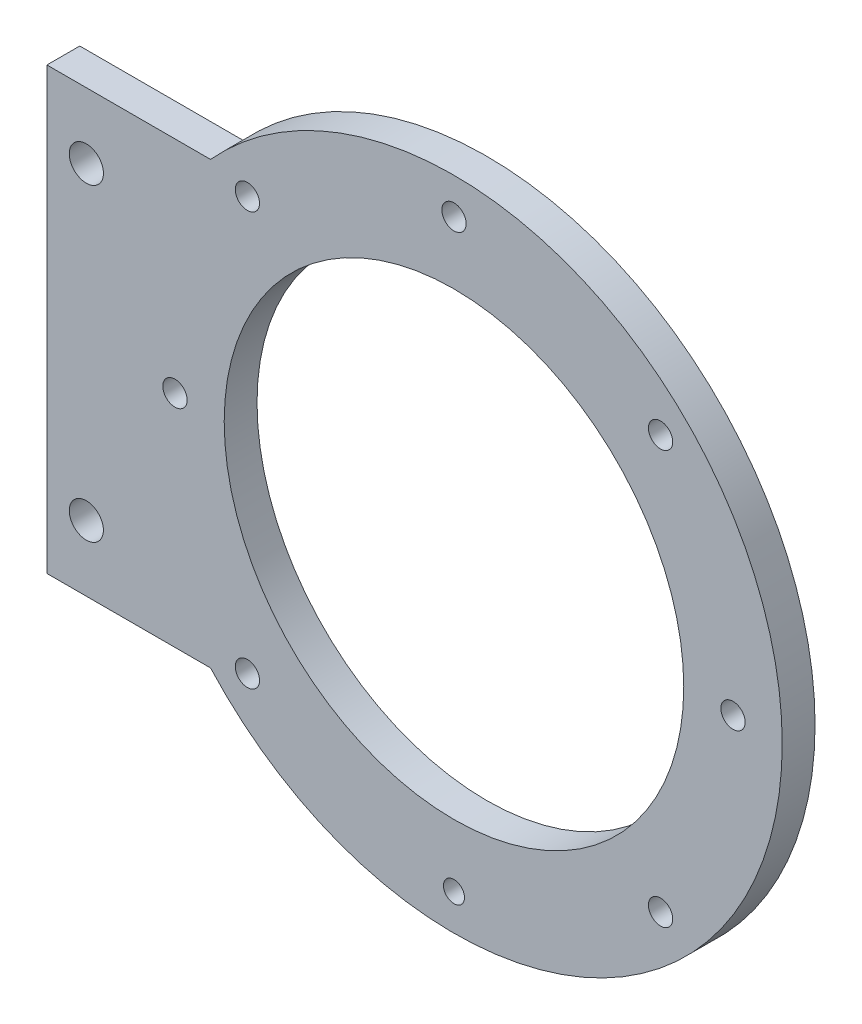
ISO-10303-21;
HEADER;
FILE_DESCRIPTION(('STEP AP214'),'2;1');
FILE_NAME('part.step','',(''),(''),'','','');
FILE_SCHEMA(('AUTOMOTIVE_DESIGN { 1 0 10303 214 1 1 1 1 }'));
ENDSEC;
DATA;
#1=APPLICATION_CONTEXT('core data for automotive mechanical design processes');
#2=APPLICATION_PROTOCOL_DEFINITION('international standard','automotive_design',2000,#1);
#3=PRODUCT_CONTEXT('',#1,'mechanical');
#4=PRODUCT('Part','Part','',(#3));
#5=PRODUCT_RELATED_PRODUCT_CATEGORY('part','',(#4));
#6=PRODUCT_DEFINITION_FORMATION('','',#4);
#7=PRODUCT_DEFINITION_CONTEXT('part definition',#1,'design');
#8=PRODUCT_DEFINITION('design','',#6,#7);
#9=PRODUCT_DEFINITION_SHAPE('','',#8);
#10=(LENGTH_UNIT() NAMED_UNIT(*) SI_UNIT(.MILLI.,.METRE.));
#11=(NAMED_UNIT(*) PLANE_ANGLE_UNIT() SI_UNIT($,.RADIAN.));
#12=(NAMED_UNIT(*) SI_UNIT($,.STERADIAN.) SOLID_ANGLE_UNIT());
#13=UNCERTAINTY_MEASURE_WITH_UNIT(LENGTH_MEASURE(1.E-05),#10,'distance_accuracy_value','');
#14=(GEOMETRIC_REPRESENTATION_CONTEXT(3) GLOBAL_UNCERTAINTY_ASSIGNED_CONTEXT((#13)) GLOBAL_UNIT_ASSIGNED_CONTEXT((#10,
#11,#12)) REPRESENTATION_CONTEXT('',''));
#15=CARTESIAN_POINT('',(0.,0.,0.));
#16=DIRECTION('',(0.,0.,1.));
#17=DIRECTION('',(1.,0.,0.));
#18=AXIS2_PLACEMENT_3D('',#15,#16,#17);
#19=CARTESIAN_POINT('',(0.,0.,-5.));
#20=DIRECTION('',(0.,1.,0.));
#21=DIRECTION('',(0.,0.,-1.));
#22=AXIS2_PLACEMENT_3D('',#19,#20,#21);
#23=PLANE('',#22);
#24=DIRECTION('',(1.,0.,0.));
#25=VECTOR('',#24,1.);
#26=CARTESIAN_POINT('',(0.,0.,0.));
#27=LINE('',#26,#25);
#28=CARTESIAN_POINT('',(-12.,0.,0.));
#29=VERTEX_POINT('',#28);
#30=CARTESIAN_POINT('',(12.9190075645217,0.,0.));
#31=VERTEX_POINT('',#30);
#32=EDGE_CURVE('E132',#29,#31,#27,.T.);
#33=ORIENTED_EDGE('',*,*,#32,.T.);
#34=DIRECTION('',(0.,0.,1.));
#35=VECTOR('',#34,1.);
#36=CARTESIAN_POINT('',(12.9190075645217,0.,-5.));
#37=LINE('',#36,#35);
#38=CARTESIAN_POINT('',(12.9190075645217,0.,-5.));
#39=VERTEX_POINT('',#38);
#40=EDGE_CURVE('E131',#39,#31,#37,.T.);
#41=ORIENTED_EDGE('',*,*,#40,.F.);
#42=DIRECTION('',(1.,0.,0.));
#43=VECTOR('',#42,1.);
#44=CARTESIAN_POINT('',(0.,0.,-5.));
#45=LINE('',#44,#43);
#46=CARTESIAN_POINT('',(-12.,0.,-5.));
#47=VERTEX_POINT('',#46);
#48=EDGE_CURVE('E114',#47,#39,#45,.T.);
#49=ORIENTED_EDGE('',*,*,#48,.F.);
#50=DIRECTION('',(0.,0.,1.));
#51=VECTOR('',#50,1.);
#52=CARTESIAN_POINT('',(-12.,0.,-5.));
#53=LINE('',#52,#51);
#54=EDGE_CURVE('E11',#47,#29,#53,.T.);
#55=ORIENTED_EDGE('',*,*,#54,.T.);
#56=EDGE_LOOP('',(#33,#41,#49,#55));
#57=FACE_BOUND('',#56,.T.);
#58=ADVANCED_FACE('F49',(#57),#23,.T.);
#59=CARTESIAN_POINT('',(-12.,0.,-5.));
#60=DIRECTION('',(-1.,0.,0.));
#61=DIRECTION('',(0.,0.,-1.));
#62=AXIS2_PLACEMENT_3D('',#59,#60,#61);
#63=PLANE('',#62);
#64=DIRECTION('',(0.,1.,0.));
#65=VECTOR('',#64,1.);
#66=CARTESIAN_POINT('',(-12.,0.,0.));
#67=LINE('',#66,#65);
#68=CARTESIAN_POINT('',(-12.,-67.0820393249937,0.));
#69=VERTEX_POINT('',#68);
#70=EDGE_CURVE('E136',#69,#29,#67,.T.);
#71=ORIENTED_EDGE('',*,*,#70,.T.);
#72=ORIENTED_EDGE('',*,*,#54,.F.);
#73=DIRECTION('',(0.,1.,0.));
#74=VECTOR('',#73,1.);
#75=CARTESIAN_POINT('',(-12.,0.,-5.));
#76=LINE('',#75,#74);
#77=CARTESIAN_POINT('',(-12.,-67.0820393249937,-5.));
#78=VERTEX_POINT('',#77);
#79=EDGE_CURVE('E93',#78,#47,#76,.T.);
#80=ORIENTED_EDGE('',*,*,#79,.F.);
#81=DIRECTION('',(0.,0.,1.));
#82=VECTOR('',#81,1.);
#83=CARTESIAN_POINT('',(-12.,-67.0820393249937,-5.));
#84=LINE('',#83,#82);
#85=EDGE_CURVE('E59',#78,#69,#84,.T.);
#86=ORIENTED_EDGE('',*,*,#85,.T.);
#87=EDGE_LOOP('',(#71,#72,#80,#86));
#88=FACE_BOUND('',#87,.T.);
#89=ADVANCED_FACE('F111',(#88),#63,.T.);
#90=CARTESIAN_POINT('',(0.,-67.0820393249937,-5.));
#91=DIRECTION('',(0.,1.,0.));
#92=DIRECTION('',(0.,0.,-1.));
#93=AXIS2_PLACEMENT_3D('',#90,#91,#92);
#94=PLANE('',#93);
#95=DIRECTION('',(1.,0.,0.));
#96=VECTOR('',#95,1.);
#97=CARTESIAN_POINT('',(0.,-67.0820393249937,0.));
#98=LINE('',#97,#96);
#99=CARTESIAN_POINT('',(12.9190075645217,-67.0820393249937,0.));
#100=VERTEX_POINT('',#99);
#101=EDGE_CURVE('E105',#69,#100,#98,.T.);
#102=ORIENTED_EDGE('',*,*,#101,.F.);
#103=ORIENTED_EDGE('',*,*,#85,.F.);
#104=DIRECTION('',(1.,0.,0.));
#105=VECTOR('',#104,1.);
#106=CARTESIAN_POINT('',(0.,-67.0820393249937,-5.));
#107=LINE('',#106,#105);
#108=CARTESIAN_POINT('',(12.9190075645217,-67.0820393249937,-5.));
#109=VERTEX_POINT('',#108);
#110=EDGE_CURVE('E96',#78,#109,#107,.T.);
#111=ORIENTED_EDGE('',*,*,#110,.T.);
#112=DIRECTION('',(0.,0.,1.));
#113=VECTOR('',#112,1.);
#114=CARTESIAN_POINT('',(12.9190075645217,-67.0820393249937,-5.));
#115=LINE('',#114,#113);
#116=EDGE_CURVE('E109',#109,#100,#115,.T.);
#117=ORIENTED_EDGE('',*,*,#116,.T.);
#118=EDGE_LOOP('',(#102,#103,#111,#117));
#119=FACE_BOUND('',#118,.T.);
#120=ADVANCED_FACE('F104',(#119),#94,.F.);
#121=CARTESIAN_POINT('',(-6.,-10.,-5.));
#122=DIRECTION('',(0.,0.,1.));
#123=DIRECTION('',(-1.,0.,0.));
#124=AXIS2_PLACEMENT_3D('',#121,#122,#123);
#125=CYLINDRICAL_SURFACE('',#124,2.6);
#126=CARTESIAN_POINT('',(-6.,-10.,-5.));
#127=DIRECTION('',(0.,0.,1.));
#128=DIRECTION('',(1.,0.,0.));
#129=AXIS2_PLACEMENT_3D('',#126,#127,#128);
#130=CIRCLE('',#129,2.6);
#131=CARTESIAN_POINT('',(-3.4,-10.,-5.));
#132=VERTEX_POINT('',#131);
#133=EDGE_CURVE('E123',#132,#132,#130,.T.);
#134=ORIENTED_EDGE('',*,*,#133,.F.);
#135=EDGE_LOOP('',(#134));
#136=FACE_BOUND('',#135,.T.);
#137=CARTESIAN_POINT('',(-6.,-10.,0.));
#138=DIRECTION('',(0.,0.,1.));
#139=DIRECTION('',(1.,0.,0.));
#140=AXIS2_PLACEMENT_3D('',#137,#138,#139);
#141=CIRCLE('',#140,2.6);
#142=CARTESIAN_POINT('',(-3.4,-10.,0.));
#143=VERTEX_POINT('',#142);
#144=EDGE_CURVE('E144',#143,#143,#141,.T.);
#145=ORIENTED_EDGE('',*,*,#144,.T.);
#146=EDGE_LOOP('',(#145));
#147=FACE_BOUND('',#146,.T.);
#148=ADVANCED_FACE('F230',(#136,#147),#125,.F.);
#149=CARTESIAN_POINT('',(50.,-33.5410196624969,-5.));
#150=DIRECTION('',(0.,0.,1.));
#151=DIRECTION('',(-1.,0.,0.));
#152=AXIS2_PLACEMENT_3D('',#149,#150,#151);
#153=CYLINDRICAL_SURFACE('',#152,50.);
#154=CARTESIAN_POINT('',(50.,-33.5410196624969,0.));
#155=DIRECTION('',(0.,0.,1.));
#156=DIRECTION('',(1.,0.,0.));
#157=AXIS2_PLACEMENT_3D('',#154,#155,#156);
#158=CIRCLE('',#157,50.);
#159=EDGE_CURVE('E82',#100,#31,#158,.T.);
#160=ORIENTED_EDGE('',*,*,#159,.F.);
#161=ORIENTED_EDGE('',*,*,#116,.F.);
#162=CARTESIAN_POINT('',(50.,-33.5410196624969,-5.));
#163=DIRECTION('',(0.,0.,1.));
#164=DIRECTION('',(1.,0.,0.));
#165=AXIS2_PLACEMENT_3D('',#162,#163,#164);
#166=CIRCLE('',#165,50.);
#167=EDGE_CURVE('E68',#109,#39,#166,.T.);
#168=ORIENTED_EDGE('',*,*,#167,.T.);
#169=ORIENTED_EDGE('',*,*,#40,.T.);
#170=EDGE_LOOP('',(#160,#161,#168,#169));
#171=FACE_BOUND('',#170,.T.);
#172=ADVANCED_FACE('F221',(#171),#153,.T.);
#173=CARTESIAN_POINT('',(-6.,-57.0820393249937,-5.));
#174=DIRECTION('',(0.,0.,1.));
#175=DIRECTION('',(-1.,0.,0.));
#176=AXIS2_PLACEMENT_3D('',#173,#174,#175);
#177=CYLINDRICAL_SURFACE('',#176,2.6);
#178=CARTESIAN_POINT('',(-6.,-57.0820393249937,-5.));
#179=DIRECTION('',(0.,0.,1.));
#180=DIRECTION('',(1.,0.,0.));
#181=AXIS2_PLACEMENT_3D('',#178,#179,#180);
#182=CIRCLE('',#181,2.6);
#183=CARTESIAN_POINT('',(-3.4,-57.0820393249937,-5.));
#184=VERTEX_POINT('',#183);
#185=EDGE_CURVE('E127',#184,#184,#182,.T.);
#186=ORIENTED_EDGE('',*,*,#185,.F.);
#187=EDGE_LOOP('',(#186));
#188=FACE_BOUND('',#187,.T.);
#189=CARTESIAN_POINT('',(-6.,-57.0820393249937,0.));
#190=DIRECTION('',(0.,0.,1.));
#191=DIRECTION('',(1.,0.,0.));
#192=AXIS2_PLACEMENT_3D('',#189,#190,#191);
#193=CIRCLE('',#192,2.6);
#194=CARTESIAN_POINT('',(-3.4,-57.0820393249937,0.));
#195=VERTEX_POINT('',#194);
#196=EDGE_CURVE('E117',#195,#195,#193,.T.);
#197=ORIENTED_EDGE('',*,*,#196,.T.);
#198=EDGE_LOOP('',(#197));
#199=FACE_BOUND('',#198,.T.);
#200=ADVANCED_FACE('F219',(#188,#199),#177,.F.);
#201=CARTESIAN_POINT('',(0.,0.,-5.));
#202=DIRECTION('',(0.,0.,-1.));
#203=DIRECTION('',(1.,0.,0.));
#204=AXIS2_PLACEMENT_3D('',#201,#202,#203);
#205=PLANE('',#204);
#206=CARTESIAN_POINT('',(50.,10.9589803375031,-5.));
#207=DIRECTION('',(0.,0.,1.));
#208=DIRECTION('',(1.,0.,0.));
#209=AXIS2_PLACEMENT_3D('',#206,#207,#208);
#210=CIRCLE('',#209,1.85);
#211=CARTESIAN_POINT('',(51.85,10.9589803375031,-5.));
#212=VERTEX_POINT('',#211);
#213=EDGE_CURVE('E160',#212,#212,#210,.T.);
#214=ORIENTED_EDGE('',*,*,#213,.T.);
#215=EDGE_LOOP('',(#214));
#216=FACE_BOUND('',#215,.T.);
#217=CARTESIAN_POINT('',(81.4662517628014,-65.0072714252982,-5.));
#218=DIRECTION('',(0.,0.,1.));
#219=DIRECTION('',(1.,0.,0.));
#220=AXIS2_PLACEMENT_3D('',#217,#218,#219);
#221=CIRCLE('',#220,1.85000000000001);
#222=CARTESIAN_POINT('',(83.3162517628014,-65.0072714252982,-5.));
#223=VERTEX_POINT('',#222);
#224=EDGE_CURVE('E403',#223,#223,#221,.T.);
#225=ORIENTED_EDGE('',*,*,#224,.T.);
#226=EDGE_LOOP('',(#225));
#227=FACE_BOUND('',#226,.T.);
#228=CARTESIAN_POINT('',(50.,-78.0410196624969,-5.));
#229=DIRECTION('',(0.,0.,1.));
#230=DIRECTION('',(1.,0.,0.));
#231=AXIS2_PLACEMENT_3D('',#228,#229,#230);
#232=CIRCLE('',#231,1.6);
#233=CARTESIAN_POINT('',(51.6,-78.0410196624969,-5.));
#234=VERTEX_POINT('',#233);
#235=EDGE_CURVE('E396',#234,#234,#232,.T.);
#236=ORIENTED_EDGE('',*,*,#235,.T.);
#237=EDGE_LOOP('',(#236));
#238=FACE_BOUND('',#237,.T.);
#239=CARTESIAN_POINT('',(18.5337482371986,-2.07476789969549,-5.));
#240=DIRECTION('',(0.,0.,1.));
#241=DIRECTION('',(1.,0.,0.));
#242=AXIS2_PLACEMENT_3D('',#239,#240,#241);
#243=CIRCLE('',#242,1.85);
#244=CARTESIAN_POINT('',(20.3837482371986,-2.07476789969549,-5.));
#245=VERTEX_POINT('',#244);
#246=EDGE_CURVE('E400',#245,#245,#243,.T.);
#247=ORIENTED_EDGE('',*,*,#246,.T.);
#248=EDGE_LOOP('',(#247));
#249=FACE_BOUND('',#248,.T.);
#250=CARTESIAN_POINT('',(81.4662517628014,-2.07476789969549,-5.));
#251=DIRECTION('',(0.,0.,1.));
#252=DIRECTION('',(1.,0.,0.));
#253=AXIS2_PLACEMENT_3D('',#250,#251,#252);
#254=CIRCLE('',#253,1.85);
#255=CARTESIAN_POINT('',(83.3162517628014,-2.07476789969549,-5.));
#256=VERTEX_POINT('',#255);
#257=EDGE_CURVE('E408',#256,#256,#254,.T.);
#258=ORIENTED_EDGE('',*,*,#257,.T.);
#259=EDGE_LOOP('',(#258));
#260=FACE_BOUND('',#259,.T.);
#261=CARTESIAN_POINT('',(18.5337482371987,-65.0072714252982,-5.));
#262=DIRECTION('',(0.,0.,1.));
#263=DIRECTION('',(1.,0.,0.));
#264=AXIS2_PLACEMENT_3D('',#261,#262,#263);
#265=CIRCLE('',#264,1.85);
#266=CARTESIAN_POINT('',(20.3837482371987,-65.0072714252982,-5.));
#267=VERTEX_POINT('',#266);
#268=EDGE_CURVE('E407',#267,#267,#265,.T.);
#269=ORIENTED_EDGE('',*,*,#268,.T.);
#270=EDGE_LOOP('',(#269));
#271=FACE_BOUND('',#270,.T.);
#272=CARTESIAN_POINT('',(50.,-33.5410196624969,-5.));
#273=DIRECTION('',(0.,0.,1.));
#274=DIRECTION('',(1.,0.,0.));
#275=AXIS2_PLACEMENT_3D('',#272,#273,#274);
#276=CIRCLE('',#275,35.);
#277=CARTESIAN_POINT('',(85.,-33.5410196624969,-5.));
#278=VERTEX_POINT('',#277);
#279=EDGE_CURVE('E178',#278,#278,#276,.T.);
#280=ORIENTED_EDGE('',*,*,#279,.T.);
#281=EDGE_LOOP('',(#280));
#282=FACE_BOUND('',#281,.T.);
#283=CARTESIAN_POINT('',(92.5,-33.5410196624969,-5.));
#284=DIRECTION('',(0.,0.,1.));
#285=DIRECTION('',(1.,0.,0.));
#286=AXIS2_PLACEMENT_3D('',#283,#284,#285);
#287=CIRCLE('',#286,1.85000000000001);
#288=CARTESIAN_POINT('',(94.35,-33.5410196624969,-5.));
#289=VERTEX_POINT('',#288);
#290=EDGE_CURVE('E196',#289,#289,#287,.T.);
#291=ORIENTED_EDGE('',*,*,#290,.T.);
#292=EDGE_LOOP('',(#291));
#293=FACE_BOUND('',#292,.T.);
#294=CARTESIAN_POINT('',(7.50000000000001,-33.5410196624969,-5.));
#295=DIRECTION('',(0.,0.,1.));
#296=DIRECTION('',(1.,0.,0.));
#297=AXIS2_PLACEMENT_3D('',#294,#295,#296);
#298=CIRCLE('',#297,1.85);
#299=CARTESIAN_POINT('',(9.35000000000001,-33.5410196624969,-5.));
#300=VERTEX_POINT('',#299);
#301=EDGE_CURVE('E200',#300,#300,#298,.T.);
#302=ORIENTED_EDGE('',*,*,#301,.T.);
#303=EDGE_LOOP('',(#302));
#304=FACE_BOUND('',#303,.T.);
#305=ORIENTED_EDGE('',*,*,#48,.T.);
#306=ORIENTED_EDGE('',*,*,#167,.F.);
#307=ORIENTED_EDGE('',*,*,#110,.F.);
#308=ORIENTED_EDGE('',*,*,#79,.T.);
#309=EDGE_LOOP('',(#305,#306,#307,#308));
#310=FACE_BOUND('',#309,.T.);
#311=ORIENTED_EDGE('',*,*,#133,.T.);
#312=EDGE_LOOP('',(#311));
#313=FACE_BOUND('',#312,.T.);
#314=ORIENTED_EDGE('',*,*,#185,.T.);
#315=EDGE_LOOP('',(#314));
#316=FACE_BOUND('',#315,.T.);
#317=ADVANCED_FACE('F98',(#216,#227,#238,#249,#260,#271,#282,#293,#304,#310,#313,#316),#205,.T.);
#318=CARTESIAN_POINT('',(0.,0.,0.));
#319=DIRECTION('',(0.,0.,-1.));
#320=DIRECTION('',(1.,0.,0.));
#321=AXIS2_PLACEMENT_3D('',#318,#319,#320);
#322=PLANE('',#321);
#323=CARTESIAN_POINT('',(50.,10.9589803375031,0.));
#324=DIRECTION('',(0.,0.,1.));
#325=DIRECTION('',(1.,0.,0.));
#326=AXIS2_PLACEMENT_3D('',#323,#324,#325);
#327=CIRCLE('',#326,1.85);
#328=CARTESIAN_POINT('',(51.85,10.9589803375031,0.));
#329=VERTEX_POINT('',#328);
#330=EDGE_CURVE('E52',#329,#329,#327,.T.);
#331=ORIENTED_EDGE('',*,*,#330,.F.);
#332=EDGE_LOOP('',(#331));
#333=FACE_BOUND('',#332,.T.);
#334=CARTESIAN_POINT('',(81.4662517628014,-65.0072714252982,0.));
#335=DIRECTION('',(0.,0.,1.));
#336=DIRECTION('',(1.,0.,0.));
#337=AXIS2_PLACEMENT_3D('',#334,#335,#336);
#338=CIRCLE('',#337,1.85000000000001);
#339=CARTESIAN_POINT('',(83.3162517628014,-65.0072714252982,0.));
#340=VERTEX_POINT('',#339);
#341=EDGE_CURVE('E171',#340,#340,#338,.T.);
#342=ORIENTED_EDGE('',*,*,#341,.F.);
#343=EDGE_LOOP('',(#342));
#344=FACE_BOUND('',#343,.T.);
#345=CARTESIAN_POINT('',(50.,-78.0410196624969,0.));
#346=DIRECTION('',(0.,0.,1.));
#347=DIRECTION('',(1.,0.,0.));
#348=AXIS2_PLACEMENT_3D('',#345,#346,#347);
#349=CIRCLE('',#348,1.6);
#350=CARTESIAN_POINT('',(51.6,-78.0410196624969,0.));
#351=VERTEX_POINT('',#350);
#352=EDGE_CURVE('E168',#351,#351,#349,.T.);
#353=ORIENTED_EDGE('',*,*,#352,.F.);
#354=EDGE_LOOP('',(#353));
#355=FACE_BOUND('',#354,.T.);
#356=CARTESIAN_POINT('',(18.5337482371986,-2.07476789969549,0.));
#357=DIRECTION('',(0.,0.,1.));
#358=DIRECTION('',(1.,0.,0.));
#359=AXIS2_PLACEMENT_3D('',#356,#357,#358);
#360=CIRCLE('',#359,1.85);
#361=CARTESIAN_POINT('',(20.3837482371986,-2.07476789969549,0.));
#362=VERTEX_POINT('',#361);
#363=EDGE_CURVE('E164',#362,#362,#360,.T.);
#364=ORIENTED_EDGE('',*,*,#363,.F.);
#365=EDGE_LOOP('',(#364));
#366=FACE_BOUND('',#365,.T.);
#367=CARTESIAN_POINT('',(81.4662517628014,-2.07476789969549,0.));
#368=DIRECTION('',(0.,0.,1.));
#369=DIRECTION('',(1.,0.,0.));
#370=AXIS2_PLACEMENT_3D('',#367,#368,#369);
#371=CIRCLE('',#370,1.85);
#372=CARTESIAN_POINT('',(83.3162517628014,-2.07476789969549,0.));
#373=VERTEX_POINT('',#372);
#374=EDGE_CURVE('E159',#373,#373,#371,.T.);
#375=ORIENTED_EDGE('',*,*,#374,.F.);
#376=EDGE_LOOP('',(#375));
#377=FACE_BOUND('',#376,.T.);
#378=CARTESIAN_POINT('',(18.5337482371987,-65.0072714252982,0.));
#379=DIRECTION('',(0.,0.,1.));
#380=DIRECTION('',(1.,0.,0.));
#381=AXIS2_PLACEMENT_3D('',#378,#379,#380);
#382=CIRCLE('',#381,1.85);
#383=CARTESIAN_POINT('',(20.3837482371987,-65.0072714252982,0.));
#384=VERTEX_POINT('',#383);
#385=EDGE_CURVE('E155',#384,#384,#382,.T.);
#386=ORIENTED_EDGE('',*,*,#385,.F.);
#387=EDGE_LOOP('',(#386));
#388=FACE_BOUND('',#387,.T.);
#389=CARTESIAN_POINT('',(50.,-33.5410196624969,0.));
#390=DIRECTION('',(0.,0.,1.));
#391=DIRECTION('',(1.,0.,0.));
#392=AXIS2_PLACEMENT_3D('',#389,#390,#391);
#393=CIRCLE('',#392,35.);
#394=CARTESIAN_POINT('',(85.,-33.5410196624969,0.));
#395=VERTEX_POINT('',#394);
#396=EDGE_CURVE('E183',#395,#395,#393,.T.);
#397=ORIENTED_EDGE('',*,*,#396,.F.);
#398=EDGE_LOOP('',(#397));
#399=FACE_BOUND('',#398,.T.);
#400=CARTESIAN_POINT('',(92.5,-33.5410196624969,0.));
#401=DIRECTION('',(0.,0.,1.));
#402=DIRECTION('',(1.,0.,0.));
#403=AXIS2_PLACEMENT_3D('',#400,#401,#402);
#404=CIRCLE('',#403,1.85000000000001);
#405=CARTESIAN_POINT('',(94.35,-33.5410196624969,0.));
#406=VERTEX_POINT('',#405);
#407=EDGE_CURVE('E137',#406,#406,#404,.T.);
#408=ORIENTED_EDGE('',*,*,#407,.F.);
#409=EDGE_LOOP('',(#408));
#410=FACE_BOUND('',#409,.T.);
#411=CARTESIAN_POINT('',(7.50000000000001,-33.5410196624969,0.));
#412=DIRECTION('',(0.,0.,1.));
#413=DIRECTION('',(1.,0.,0.));
#414=AXIS2_PLACEMENT_3D('',#411,#412,#413);
#415=CIRCLE('',#414,1.85);
#416=CARTESIAN_POINT('',(9.35000000000001,-33.5410196624969,0.));
#417=VERTEX_POINT('',#416);
#418=EDGE_CURVE('E189',#417,#417,#415,.T.);
#419=ORIENTED_EDGE('',*,*,#418,.F.);
#420=EDGE_LOOP('',(#419));
#421=FACE_BOUND('',#420,.T.);
#422=ORIENTED_EDGE('',*,*,#32,.F.);
#423=ORIENTED_EDGE('',*,*,#70,.F.);
#424=ORIENTED_EDGE('',*,*,#101,.T.);
#425=ORIENTED_EDGE('',*,*,#159,.T.);
#426=EDGE_LOOP('',(#422,#423,#424,#425));
#427=FACE_BOUND('',#426,.T.);
#428=ORIENTED_EDGE('',*,*,#144,.F.);
#429=EDGE_LOOP('',(#428));
#430=FACE_BOUND('',#429,.T.);
#431=ORIENTED_EDGE('',*,*,#196,.F.);
#432=EDGE_LOOP('',(#431));
#433=FACE_BOUND('',#432,.T.);
#434=ADVANCED_FACE('F210',(#333,#344,#355,#366,#377,#388,#399,#410,#421,#427,#430,#433),#322,.F.);
#435=CARTESIAN_POINT('',(7.50000000000001,-33.5410196624969,0.));
#436=DIRECTION('',(0.,0.,-1.));
#437=DIRECTION('',(1.,0.,0.));
#438=AXIS2_PLACEMENT_3D('',#435,#436,#437);
#439=CYLINDRICAL_SURFACE('',#438,1.85);
#440=ORIENTED_EDGE('',*,*,#418,.T.);
#441=EDGE_LOOP('',(#440));
#442=FACE_BOUND('',#441,.T.);
#443=ORIENTED_EDGE('',*,*,#301,.F.);
#444=EDGE_LOOP('',(#443));
#445=FACE_BOUND('',#444,.T.);
#446=ADVANCED_FACE('F207',(#442,#445),#439,.F.);
#447=CARTESIAN_POINT('',(92.5,-33.5410196624969,0.));
#448=DIRECTION('',(0.,0.,-1.));
#449=DIRECTION('',(1.,0.,0.));
#450=AXIS2_PLACEMENT_3D('',#447,#448,#449);
#451=CYLINDRICAL_SURFACE('',#450,1.85000000000001);
#452=ORIENTED_EDGE('',*,*,#407,.T.);
#453=EDGE_LOOP('',(#452));
#454=FACE_BOUND('',#453,.T.);
#455=ORIENTED_EDGE('',*,*,#290,.F.);
#456=EDGE_LOOP('',(#455));
#457=FACE_BOUND('',#456,.T.);
#458=ADVANCED_FACE('F310',(#454,#457),#451,.F.);
#459=CARTESIAN_POINT('',(50.,-33.5410196624969,0.));
#460=DIRECTION('',(0.,0.,-1.));
#461=DIRECTION('',(1.,0.,0.));
#462=AXIS2_PLACEMENT_3D('',#459,#460,#461);
#463=CYLINDRICAL_SURFACE('',#462,35.);
#464=ORIENTED_EDGE('',*,*,#396,.T.);
#465=EDGE_LOOP('',(#464));
#466=FACE_BOUND('',#465,.T.);
#467=ORIENTED_EDGE('',*,*,#279,.F.);
#468=EDGE_LOOP('',(#467));
#469=FACE_BOUND('',#468,.T.);
#470=ADVANCED_FACE('F319',(#466,#469),#463,.F.);
#471=CARTESIAN_POINT('',(18.5337482371987,-65.0072714252982,5.));
#472=DIRECTION('',(0.,0.,-1.));
#473=DIRECTION('',(1.,0.,0.));
#474=AXIS2_PLACEMENT_3D('',#471,#472,#473);
#475=CYLINDRICAL_SURFACE('',#474,1.85);
#476=ORIENTED_EDGE('',*,*,#268,.F.);
#477=EDGE_LOOP('',(#476));
#478=FACE_BOUND('',#477,.T.);
#479=ORIENTED_EDGE('',*,*,#385,.T.);
#480=EDGE_LOOP('',(#479));
#481=FACE_BOUND('',#480,.T.);
#482=ADVANCED_FACE('F330',(#478,#481),#475,.F.);
#483=CARTESIAN_POINT('',(81.4662517628014,-2.07476789969549,5.));
#484=DIRECTION('',(0.,0.,-1.));
#485=DIRECTION('',(1.,0.,0.));
#486=AXIS2_PLACEMENT_3D('',#483,#484,#485);
#487=CYLINDRICAL_SURFACE('',#486,1.85);
#488=ORIENTED_EDGE('',*,*,#257,.F.);
#489=EDGE_LOOP('',(#488));
#490=FACE_BOUND('',#489,.T.);
#491=ORIENTED_EDGE('',*,*,#374,.T.);
#492=EDGE_LOOP('',(#491));
#493=FACE_BOUND('',#492,.T.);
#494=ADVANCED_FACE('F340',(#490,#493),#487,.F.);
#495=CARTESIAN_POINT('',(18.5337482371986,-2.07476789969549,5.));
#496=DIRECTION('',(0.,0.,-1.));
#497=DIRECTION('',(1.,0.,0.));
#498=AXIS2_PLACEMENT_3D('',#495,#496,#497);
#499=CYLINDRICAL_SURFACE('',#498,1.85);
#500=ORIENTED_EDGE('',*,*,#246,.F.);
#501=EDGE_LOOP('',(#500));
#502=FACE_BOUND('',#501,.T.);
#503=ORIENTED_EDGE('',*,*,#363,.T.);
#504=EDGE_LOOP('',(#503));
#505=FACE_BOUND('',#504,.T.);
#506=ADVANCED_FACE('F350',(#502,#505),#499,.F.);
#507=CARTESIAN_POINT('',(50.,-78.0410196624969,5.));
#508=DIRECTION('',(0.,0.,-1.));
#509=DIRECTION('',(1.,0.,0.));
#510=AXIS2_PLACEMENT_3D('',#507,#508,#509);
#511=CYLINDRICAL_SURFACE('',#510,1.6);
#512=ORIENTED_EDGE('',*,*,#235,.F.);
#513=EDGE_LOOP('',(#512));
#514=FACE_BOUND('',#513,.T.);
#515=ORIENTED_EDGE('',*,*,#352,.T.);
#516=EDGE_LOOP('',(#515));
#517=FACE_BOUND('',#516,.T.);
#518=ADVANCED_FACE('F360',(#514,#517),#511,.F.);
#519=CARTESIAN_POINT('',(81.4662517628014,-65.0072714252982,5.));
#520=DIRECTION('',(0.,0.,-1.));
#521=DIRECTION('',(1.,0.,0.));
#522=AXIS2_PLACEMENT_3D('',#519,#520,#521);
#523=CYLINDRICAL_SURFACE('',#522,1.85000000000001);
#524=ORIENTED_EDGE('',*,*,#224,.F.);
#525=EDGE_LOOP('',(#524));
#526=FACE_BOUND('',#525,.T.);
#527=ORIENTED_EDGE('',*,*,#341,.T.);
#528=EDGE_LOOP('',(#527));
#529=FACE_BOUND('',#528,.T.);
#530=ADVANCED_FACE('F370',(#526,#529),#523,.F.);
#531=CARTESIAN_POINT('',(50.,10.9589803375031,5.));
#532=DIRECTION('',(0.,0.,-1.));
#533=DIRECTION('',(1.,0.,0.));
#534=AXIS2_PLACEMENT_3D('',#531,#532,#533);
#535=CYLINDRICAL_SURFACE('',#534,1.85);
#536=ORIENTED_EDGE('',*,*,#213,.F.);
#537=EDGE_LOOP('',(#536));
#538=FACE_BOUND('',#537,.T.);
#539=ORIENTED_EDGE('',*,*,#330,.T.);
#540=EDGE_LOOP('',(#539));
#541=FACE_BOUND('',#540,.T.);
#542=ADVANCED_FACE('F380',(#538,#541),#535,.F.);
#543=CLOSED_SHELL('',(#58,#89,#120,#148,#172,#200,#317,#434,#446,#458,#470,#482,#494,#506,#518,
#530,#542));
#544=MANIFOLD_SOLID_BREP('B2',#543);
#545=ADVANCED_BREP_SHAPE_REPRESENTATION('',(#18,#544),#14);
#546=SHAPE_DEFINITION_REPRESENTATION(#9,#545);
ENDSEC;
END-ISO-10303-21;
